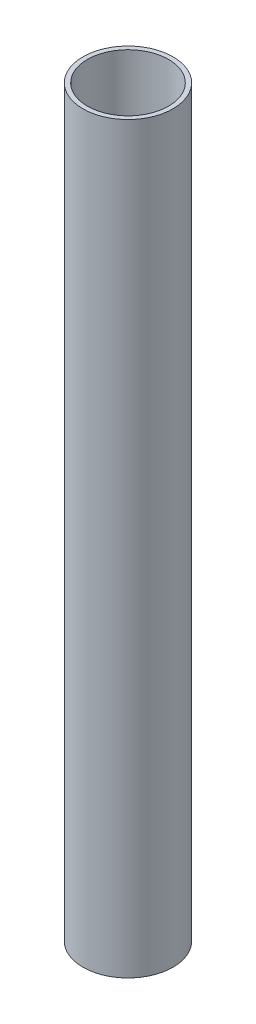
ISO-10303-21;
HEADER;
FILE_DESCRIPTION(('STEP AP214'),'2;1');
FILE_NAME('part.step','',(''),(''),'','','');
FILE_SCHEMA(('AUTOMOTIVE_DESIGN { 1 0 10303 214 1 1 1 1 }'));
ENDSEC;
DATA;
#1=APPLICATION_CONTEXT('core data for automotive mechanical design processes');
#2=APPLICATION_PROTOCOL_DEFINITION('international standard','automotive_design',2000,#1);
#3=PRODUCT_CONTEXT('',#1,'mechanical');
#4=PRODUCT('Part','Part','',(#3));
#5=PRODUCT_RELATED_PRODUCT_CATEGORY('part','',(#4));
#6=PRODUCT_DEFINITION_FORMATION('','',#4);
#7=PRODUCT_DEFINITION_CONTEXT('part definition',#1,'design');
#8=PRODUCT_DEFINITION('design','',#6,#7);
#9=PRODUCT_DEFINITION_SHAPE('','',#8);
#10=(LENGTH_UNIT() NAMED_UNIT(*) SI_UNIT(.MILLI.,.METRE.));
#11=(NAMED_UNIT(*) PLANE_ANGLE_UNIT() SI_UNIT($,.RADIAN.));
#12=(NAMED_UNIT(*) SI_UNIT($,.STERADIAN.) SOLID_ANGLE_UNIT());
#13=UNCERTAINTY_MEASURE_WITH_UNIT(LENGTH_MEASURE(1.E-05),#10,'distance_accuracy_value','');
#14=(GEOMETRIC_REPRESENTATION_CONTEXT(3) GLOBAL_UNCERTAINTY_ASSIGNED_CONTEXT((#13)) GLOBAL_UNIT_ASSIGNED_CONTEXT((#10,
#11,#12)) REPRESENTATION_CONTEXT('',''));
#15=CARTESIAN_POINT('',(0.,0.,0.));
#16=DIRECTION('',(0.,0.,1.));
#17=DIRECTION('',(1.,0.,0.));
#18=AXIS2_PLACEMENT_3D('',#15,#16,#17);
#19=CARTESIAN_POINT('',(0.,330.,0.));
#20=DIRECTION('',(0.,1.,0.));
#21=DIRECTION('',(0.,0.,1.));
#22=AXIS2_PLACEMENT_3D('',#19,#20,#21);
#23=PLANE('',#22);
#24=CARTESIAN_POINT('',(0.,330.,0.));
#25=DIRECTION('',(0.,1.,0.));
#26=DIRECTION('',(0.,0.,1.));
#27=AXIS2_PLACEMENT_3D('',#24,#25,#26);
#28=CIRCLE('',#27,20.);
#29=CARTESIAN_POINT('',(0.,330.,20.));
#30=VERTEX_POINT('',#29);
#31=EDGE_CURVE('E10',#30,#30,#28,.T.);
#32=ORIENTED_EDGE('',*,*,#31,.T.);
#33=EDGE_LOOP('',(#32));
#34=FACE_BOUND('',#33,.T.);
#35=CARTESIAN_POINT('',(0.,330.,0.));
#36=DIRECTION('',(0.,1.,0.));
#37=DIRECTION('',(0.,0.,1.));
#38=AXIS2_PLACEMENT_3D('',#35,#36,#37);
#39=CIRCLE('',#38,18.);
#40=CARTESIAN_POINT('',(0.,330.,18.));
#41=VERTEX_POINT('',#40);
#42=EDGE_CURVE('E42',#41,#41,#39,.T.);
#43=ORIENTED_EDGE('',*,*,#42,.F.);
#44=EDGE_LOOP('',(#43));
#45=FACE_BOUND('',#44,.T.);
#46=ADVANCED_FACE('F31',(#34,#45),#23,.T.);
#47=CARTESIAN_POINT('',(0.,0.,0.));
#48=DIRECTION('',(0.,1.,0.));
#49=DIRECTION('',(0.,0.,1.));
#50=AXIS2_PLACEMENT_3D('',#47,#48,#49);
#51=PLANE('',#50);
#52=CARTESIAN_POINT('',(0.,0.,0.));
#53=DIRECTION('',(0.,1.,0.));
#54=DIRECTION('',(0.,0.,1.));
#55=AXIS2_PLACEMENT_3D('',#52,#53,#54);
#56=CIRCLE('',#55,20.);
#57=CARTESIAN_POINT('',(0.,0.,20.));
#58=VERTEX_POINT('',#57);
#59=EDGE_CURVE('E35',#58,#58,#56,.T.);
#60=ORIENTED_EDGE('',*,*,#59,.F.);
#61=EDGE_LOOP('',(#60));
#62=FACE_BOUND('',#61,.T.);
#63=CARTESIAN_POINT('',(0.,0.,0.));
#64=DIRECTION('',(0.,1.,0.));
#65=DIRECTION('',(0.,0.,1.));
#66=AXIS2_PLACEMENT_3D('',#63,#64,#65);
#67=CIRCLE('',#66,18.);
#68=CARTESIAN_POINT('',(0.,0.,18.));
#69=VERTEX_POINT('',#68);
#70=EDGE_CURVE('E44',#69,#69,#67,.T.);
#71=ORIENTED_EDGE('',*,*,#70,.T.);
#72=EDGE_LOOP('',(#71));
#73=FACE_BOUND('',#72,.T.);
#74=ADVANCED_FACE('F54',(#62,#73),#51,.F.);
#75=CARTESIAN_POINT('',(0.,330.,0.));
#76=DIRECTION('',(0.,-1.,0.));
#77=DIRECTION('',(0.,0.,-1.));
#78=AXIS2_PLACEMENT_3D('',#75,#76,#77);
#79=CYLINDRICAL_SURFACE('',#78,20.);
#80=ORIENTED_EDGE('',*,*,#31,.F.);
#81=EDGE_LOOP('',(#80));
#82=FACE_BOUND('',#81,.T.);
#83=ORIENTED_EDGE('',*,*,#59,.T.);
#84=EDGE_LOOP('',(#83));
#85=FACE_BOUND('',#84,.T.);
#86=ADVANCED_FACE('F33',(#82,#85),#79,.T.);
#87=CARTESIAN_POINT('',(0.,330.,0.));
#88=DIRECTION('',(0.,-1.,0.));
#89=DIRECTION('',(0.,0.,-1.));
#90=AXIS2_PLACEMENT_3D('',#87,#88,#89);
#91=CYLINDRICAL_SURFACE('',#90,18.);
#92=ORIENTED_EDGE('',*,*,#42,.T.);
#93=EDGE_LOOP('',(#92));
#94=FACE_BOUND('',#93,.T.);
#95=ORIENTED_EDGE('',*,*,#70,.F.);
#96=EDGE_LOOP('',(#95));
#97=FACE_BOUND('',#96,.T.);
#98=ADVANCED_FACE('F50',(#94,#97),#91,.F.);
#99=CLOSED_SHELL('',(#46,#74,#86,#98));
#100=MANIFOLD_SOLID_BREP('B2',#99);
#101=ADVANCED_BREP_SHAPE_REPRESENTATION('',(#18,#100),#14);
#102=SHAPE_DEFINITION_REPRESENTATION(#9,#101);
ENDSEC;
END-ISO-10303-21;
